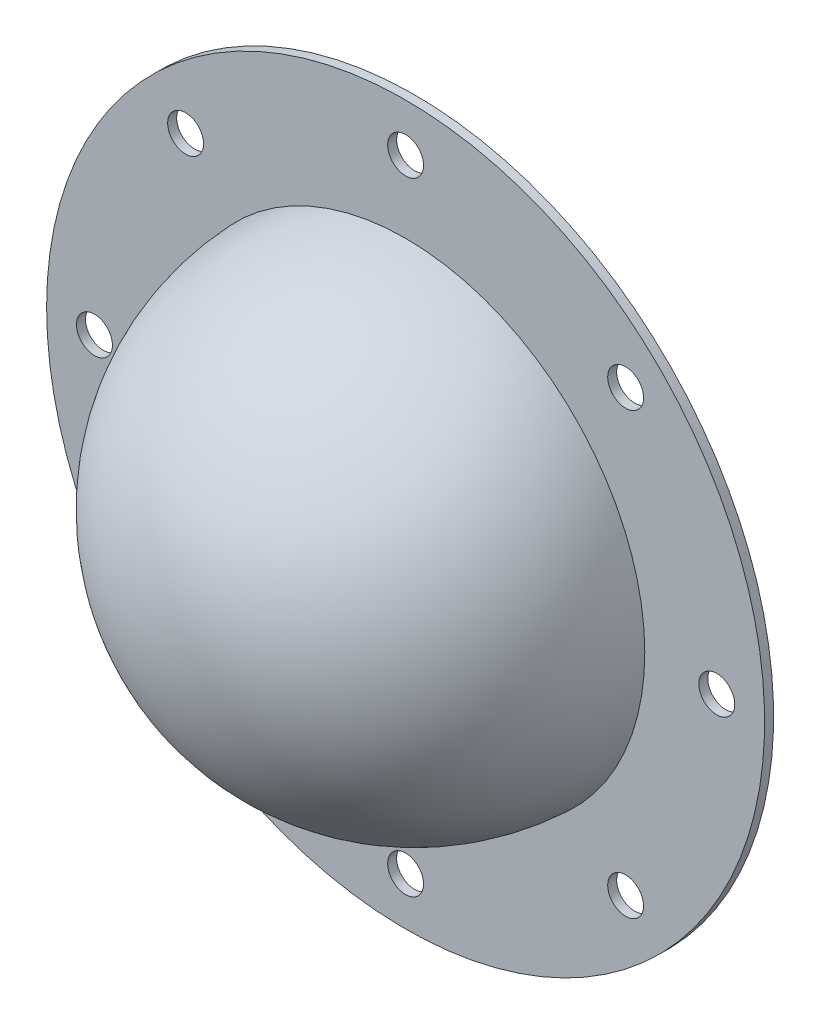
ISO-10303-21;
HEADER;
FILE_DESCRIPTION(('STEP AP214'),'2;1');
FILE_NAME('part.step','',(''),(''),'','','');
FILE_SCHEMA(('AUTOMOTIVE_DESIGN { 1 0 10303 214 1 1 1 1 }'));
ENDSEC;
DATA;
#1=APPLICATION_CONTEXT('core data for automotive mechanical design processes');
#2=APPLICATION_PROTOCOL_DEFINITION('international standard','automotive_design',2000,#1);
#3=PRODUCT_CONTEXT('',#1,'mechanical');
#4=PRODUCT('Part','Part','',(#3));
#5=PRODUCT_RELATED_PRODUCT_CATEGORY('part','',(#4));
#6=PRODUCT_DEFINITION_FORMATION('','',#4);
#7=PRODUCT_DEFINITION_CONTEXT('part definition',#1,'design');
#8=PRODUCT_DEFINITION('design','',#6,#7);
#9=PRODUCT_DEFINITION_SHAPE('','',#8);
#10=(LENGTH_UNIT() NAMED_UNIT(*) SI_UNIT(.MILLI.,.METRE.));
#11=(NAMED_UNIT(*) PLANE_ANGLE_UNIT() SI_UNIT($,.RADIAN.));
#12=(NAMED_UNIT(*) SI_UNIT($,.STERADIAN.) SOLID_ANGLE_UNIT());
#13=UNCERTAINTY_MEASURE_WITH_UNIT(LENGTH_MEASURE(1.E-05),#10,'distance_accuracy_value','');
#14=(GEOMETRIC_REPRESENTATION_CONTEXT(3) GLOBAL_UNCERTAINTY_ASSIGNED_CONTEXT((#13)) GLOBAL_UNIT_ASSIGNED_CONTEXT((#10,
#11,#12)) REPRESENTATION_CONTEXT('',''));
#15=CARTESIAN_POINT('',(0.,0.,0.));
#16=DIRECTION('',(0.,0.,1.));
#17=DIRECTION('',(1.,0.,0.));
#18=AXIS2_PLACEMENT_3D('',#15,#16,#17);
#19=CARTESIAN_POINT('',(-18.7622063786877,13.2376651058153,0.));
#20=DIRECTION('',(0.,0.,1.));
#21=DIRECTION('',(1.,0.,0.));
#22=AXIS2_PLACEMENT_3D('',#19,#20,#21);
#23=PLANE('',#22);
#24=CARTESIAN_POINT('',(-1.81557029619843E-13,52.,0.));
#25=DIRECTION('',(0.,0.,1.));
#26=DIRECTION('',(1.,0.,0.));
#27=AXIS2_PLACEMENT_3D('',#24,#25,#26);
#28=CIRCLE('',#27,3.);
#29=CARTESIAN_POINT('',(2.99999999999982,52.,0.));
#30=VERTEX_POINT('',#29);
#31=EDGE_CURVE('E71',#30,#30,#28,.T.);
#32=ORIENTED_EDGE('',*,*,#31,.T.);
#33=EDGE_LOOP('',(#32));
#34=FACE_BOUND('',#33,.T.);
#35=CARTESIAN_POINT('',(-36.7695526217007,36.7695526217003,0.));
#36=DIRECTION('',(0.,0.,1.));
#37=DIRECTION('',(1.,0.,0.));
#38=AXIS2_PLACEMENT_3D('',#35,#36,#37);
#39=CIRCLE('',#38,3.);
#40=CARTESIAN_POINT('',(-33.7695526217007,36.7695526217003,0.));
#41=VERTEX_POINT('',#40);
#42=EDGE_CURVE('E74',#41,#41,#39,.T.);
#43=ORIENTED_EDGE('',*,*,#42,.T.);
#44=EDGE_LOOP('',(#43));
#45=FACE_BOUND('',#44,.T.);
#46=CARTESIAN_POINT('',(-52.,0.,0.));
#47=DIRECTION('',(0.,0.,1.));
#48=DIRECTION('',(1.,0.,0.));
#49=AXIS2_PLACEMENT_3D('',#46,#47,#48);
#50=CIRCLE('',#49,3.);
#51=CARTESIAN_POINT('',(-49.,0.,0.));
#52=VERTEX_POINT('',#51);
#53=EDGE_CURVE('E77',#52,#52,#50,.T.);
#54=ORIENTED_EDGE('',*,*,#53,.T.);
#55=EDGE_LOOP('',(#54));
#56=FACE_BOUND('',#55,.T.);
#57=CARTESIAN_POINT('',(-36.7695526217002,-36.7695526217008,0.));
#58=DIRECTION('',(0.,0.,1.));
#59=DIRECTION('',(1.,0.,0.));
#60=AXIS2_PLACEMENT_3D('',#57,#58,#59);
#61=CIRCLE('',#60,3.);
#62=CARTESIAN_POINT('',(-33.7695526217001,-36.7695526217008,0.));
#63=VERTEX_POINT('',#62);
#64=EDGE_CURVE('E80',#63,#63,#61,.T.);
#65=ORIENTED_EDGE('',*,*,#64,.T.);
#66=EDGE_LOOP('',(#65));
#67=FACE_BOUND('',#66,.T.);
#68=CARTESIAN_POINT('',(5.44671088859529E-13,-52.,0.));
#69=DIRECTION('',(0.,0.,1.));
#70=DIRECTION('',(1.,0.,0.));
#71=AXIS2_PLACEMENT_3D('',#68,#69,#70);
#72=CIRCLE('',#71,3.);
#73=CARTESIAN_POINT('',(3.00000000000055,-52.,0.));
#74=VERTEX_POINT('',#73);
#75=EDGE_CURVE('E83',#74,#74,#72,.T.);
#76=ORIENTED_EDGE('',*,*,#75,.T.);
#77=EDGE_LOOP('',(#76));
#78=FACE_BOUND('',#77,.T.);
#79=CARTESIAN_POINT('',(36.7695526217009,-36.7695526217,0.));
#80=DIRECTION('',(0.,0.,1.));
#81=DIRECTION('',(1.,0.,0.));
#82=AXIS2_PLACEMENT_3D('',#79,#80,#81);
#83=CIRCLE('',#82,3.);
#84=CARTESIAN_POINT('',(39.7695526217009,-36.7695526217,0.));
#85=VERTEX_POINT('',#84);
#86=EDGE_CURVE('E86',#85,#85,#83,.T.);
#87=ORIENTED_EDGE('',*,*,#86,.T.);
#88=EDGE_LOOP('',(#87));
#89=FACE_BOUND('',#88,.T.);
#90=CARTESIAN_POINT('',(36.7695526217004,36.7695526217005,0.));
#91=DIRECTION('',(0.,0.,1.));
#92=DIRECTION('',(1.,0.,0.));
#93=AXIS2_PLACEMENT_3D('',#90,#91,#92);
#94=CIRCLE('',#93,3.);
#95=CARTESIAN_POINT('',(39.7695526217004,36.7695526217005,0.));
#96=VERTEX_POINT('',#95);
#97=EDGE_CURVE('E89',#96,#96,#94,.T.);
#98=ORIENTED_EDGE('',*,*,#97,.T.);
#99=EDGE_LOOP('',(#98));
#100=FACE_BOUND('',#99,.T.);
#101=CARTESIAN_POINT('',(52.,0.,0.));
#102=DIRECTION('',(0.,0.,1.));
#103=DIRECTION('',(1.,0.,0.));
#104=AXIS2_PLACEMENT_3D('',#101,#102,#103);
#105=CIRCLE('',#104,3.);
#106=CARTESIAN_POINT('',(55.,0.,0.));
#107=VERTEX_POINT('',#106);
#108=EDGE_CURVE('E65',#107,#107,#105,.T.);
#109=ORIENTED_EDGE('',*,*,#108,.T.);
#110=EDGE_LOOP('',(#109));
#111=FACE_BOUND('',#110,.T.);
#112=CARTESIAN_POINT('',(0.,0.,0.));
#113=DIRECTION('',(0.,0.,-1.));
#114=DIRECTION('',(-1.,0.,0.));
#115=AXIS2_PLACEMENT_3D('',#112,#113,#114);
#116=CIRCLE('',#115,60.);
#117=CARTESIAN_POINT('',(-60.,0.,0.));
#118=VERTEX_POINT('',#117);
#119=EDGE_CURVE('E48',#118,#118,#116,.T.);
#120=ORIENTED_EDGE('',*,*,#119,.T.);
#121=EDGE_LOOP('',(#120));
#122=FACE_BOUND('',#121,.T.);
#123=CARTESIAN_POINT('',(0.,0.,0.));
#124=DIRECTION('',(0.,0.,-1.));
#125=DIRECTION('',(-1.,0.,0.));
#126=AXIS2_PLACEMENT_3D('',#123,#124,#125);
#127=CIRCLE('',#126,45.);
#128=CARTESIAN_POINT('',(-45.,0.,0.));
#129=VERTEX_POINT('',#128);
#130=EDGE_CURVE('E52',#129,#129,#127,.T.);
#131=ORIENTED_EDGE('',*,*,#130,.F.);
#132=EDGE_LOOP('',(#131));
#133=FACE_BOUND('',#132,.T.);
#134=ADVANCED_FACE('F33',(#34,#45,#56,#67,#78,#89,#100,#111,#122,#133),#23,.F.);
#135=CARTESIAN_POINT('',(0.,0.,1.5));
#136=DIRECTION('',(0.,0.,-1.));
#137=DIRECTION('',(-1.,0.,0.));
#138=AXIS2_PLACEMENT_3D('',#135,#136,#137);
#139=CYLINDRICAL_SURFACE('',#138,60.);
#140=CARTESIAN_POINT('',(0.,0.,1.5));
#141=DIRECTION('',(0.,0.,-1.));
#142=DIRECTION('',(-1.,0.,0.));
#143=AXIS2_PLACEMENT_3D('',#140,#141,#142);
#144=CIRCLE('',#143,60.);
#145=CARTESIAN_POINT('',(-60.,0.,1.5));
#146=VERTEX_POINT('',#145);
#147=EDGE_CURVE('E44',#146,#146,#144,.T.);
#148=ORIENTED_EDGE('',*,*,#147,.T.);
#149=EDGE_LOOP('',(#148));
#150=FACE_BOUND('',#149,.T.);
#151=ORIENTED_EDGE('',*,*,#119,.F.);
#152=EDGE_LOOP('',(#151));
#153=FACE_BOUND('',#152,.T.);
#154=ADVANCED_FACE('F120',(#150,#153),#139,.T.);
#155=CARTESIAN_POINT('',(0.,0.,1.5));
#156=DIRECTION('',(0.,0.,-1.));
#157=DIRECTION('',(-1.,0.,0.));
#158=AXIS2_PLACEMENT_3D('',#155,#156,#157);
#159=PLANE('',#158);
#160=CARTESIAN_POINT('',(-1.81557029619843E-13,52.,1.5));
#161=DIRECTION('',(0.,0.,1.));
#162=DIRECTION('',(0.,1.,0.));
#163=AXIS2_PLACEMENT_3D('',#160,#161,#162);
#164=CIRCLE('',#163,3.);
#165=CARTESIAN_POINT('',(-1.92031473636372E-13,55.,1.5));
#166=VERTEX_POINT('',#165);
#167=EDGE_CURVE('E95',#166,#166,#164,.T.);
#168=ORIENTED_EDGE('',*,*,#167,.F.);
#169=EDGE_LOOP('',(#168));
#170=FACE_BOUND('',#169,.T.);
#171=CARTESIAN_POINT('',(-36.7695526217007,36.7695526217003,1.5));
#172=DIRECTION('',(0.,0.,1.));
#173=DIRECTION('',(-0.707106781186551,0.707106781186544,0.));
#174=AXIS2_PLACEMENT_3D('',#171,#172,#173);
#175=CIRCLE('',#174,3.);
#176=CARTESIAN_POINT('',(-38.8908729652603,38.8908729652599,1.5));
#177=VERTEX_POINT('',#176);
#178=EDGE_CURVE('E103',#177,#177,#175,.T.);
#179=ORIENTED_EDGE('',*,*,#178,.F.);
#180=EDGE_LOOP('',(#179));
#181=FACE_BOUND('',#180,.T.);
#182=CARTESIAN_POINT('',(-52.,0.,1.5));
#183=DIRECTION('',(0.,0.,1.));
#184=DIRECTION('',(-1.,0.,0.));
#185=AXIS2_PLACEMENT_3D('',#182,#183,#184);
#186=CIRCLE('',#185,3.);
#187=CARTESIAN_POINT('',(-55.,0.,1.5));
#188=VERTEX_POINT('',#187);
#189=EDGE_CURVE('E99',#188,#188,#186,.T.);
#190=ORIENTED_EDGE('',*,*,#189,.F.);
#191=EDGE_LOOP('',(#190));
#192=FACE_BOUND('',#191,.T.);
#193=CARTESIAN_POINT('',(-36.7695526217002,-36.7695526217008,1.5));
#194=DIRECTION('',(0.,0.,1.));
#195=DIRECTION('',(-0.707106781186541,-0.707106781186554,0.));
#196=AXIS2_PLACEMENT_3D('',#193,#194,#195);
#197=CIRCLE('',#196,3.);
#198=CARTESIAN_POINT('',(-38.8908729652598,-38.8908729652604,1.5));
#199=VERTEX_POINT('',#198);
#200=EDGE_CURVE('E96',#199,#199,#197,.T.);
#201=ORIENTED_EDGE('',*,*,#200,.F.);
#202=EDGE_LOOP('',(#201));
#203=FACE_BOUND('',#202,.T.);
#204=CARTESIAN_POINT('',(5.44671088859529E-13,-52.,1.5));
#205=DIRECTION('',(0.,0.,1.));
#206=DIRECTION('',(0.,-1.,0.));
#207=AXIS2_PLACEMENT_3D('',#204,#205,#206);
#208=CIRCLE('',#207,3.);
#209=CARTESIAN_POINT('',(5.76094420909117E-13,-55.,1.5));
#210=VERTEX_POINT('',#209);
#211=EDGE_CURVE('E100',#210,#210,#208,.T.);
#212=ORIENTED_EDGE('',*,*,#211,.F.);
#213=EDGE_LOOP('',(#212));
#214=FACE_BOUND('',#213,.T.);
#215=CARTESIAN_POINT('',(36.7695526217009,-36.7695526217,1.5));
#216=DIRECTION('',(0.,0.,1.));
#217=DIRECTION('',(0.707106781186556,-0.707106781186539,0.));
#218=AXIS2_PLACEMENT_3D('',#215,#216,#217);
#219=CIRCLE('',#218,3.);
#220=CARTESIAN_POINT('',(38.8908729652606,-38.8908729652596,1.5));
#221=VERTEX_POINT('',#220);
#222=EDGE_CURVE('E108',#221,#221,#219,.T.);
#223=ORIENTED_EDGE('',*,*,#222,.F.);
#224=EDGE_LOOP('',(#223));
#225=FACE_BOUND('',#224,.T.);
#226=CARTESIAN_POINT('',(36.7695526217004,36.7695526217005,1.5));
#227=DIRECTION('',(0.,0.,1.));
#228=DIRECTION('',(0.707106781186546,0.707106781186549,0.));
#229=AXIS2_PLACEMENT_3D('',#226,#227,#228);
#230=CIRCLE('',#229,3.);
#231=CARTESIAN_POINT('',(38.89087296526,38.8908729652602,1.5));
#232=VERTEX_POINT('',#231);
#233=EDGE_CURVE('E92',#232,#232,#230,.T.);
#234=ORIENTED_EDGE('',*,*,#233,.F.);
#235=EDGE_LOOP('',(#234));
#236=FACE_BOUND('',#235,.T.);
#237=CARTESIAN_POINT('',(52.,0.,1.5));
#238=DIRECTION('',(0.,0.,1.));
#239=DIRECTION('',(1.,0.,0.));
#240=AXIS2_PLACEMENT_3D('',#237,#238,#239);
#241=CIRCLE('',#240,3.);
#242=CARTESIAN_POINT('',(55.,0.,1.5));
#243=VERTEX_POINT('',#242);
#244=EDGE_CURVE('E68',#243,#243,#241,.T.);
#245=ORIENTED_EDGE('',*,*,#244,.F.);
#246=EDGE_LOOP('',(#245));
#247=FACE_BOUND('',#246,.T.);
#248=CARTESIAN_POINT('',(0.,0.,1.5));
#249=DIRECTION('',(0.,0.,-1.));
#250=DIRECTION('',(-1.,0.,0.));
#251=AXIS2_PLACEMENT_3D('',#248,#249,#250);
#252=CIRCLE('',#251,39.9718651053463);
#253=CARTESIAN_POINT('',(-39.9718651053463,0.,1.5));
#254=VERTEX_POINT('',#253);
#255=EDGE_CURVE('E10',#254,#254,#252,.T.);
#256=ORIENTED_EDGE('',*,*,#255,.T.);
#257=EDGE_LOOP('',(#256));
#258=FACE_BOUND('',#257,.T.);
#259=ORIENTED_EDGE('',*,*,#147,.F.);
#260=EDGE_LOOP('',(#259));
#261=FACE_BOUND('',#260,.T.);
#262=ADVANCED_FACE('F117',(#170,#181,#192,#203,#214,#225,#236,#247,#258,#261),#159,.F.);
#263=CARTESIAN_POINT('',(0.,0.,0.));
#264=DIRECTION('',(0.,0.,1.));
#265=DIRECTION('',(0.,1.,0.));
#266=AXIS2_PLACEMENT_3D('',#263,#264,#265);
#267=SPHERICAL_SURFACE('',#266,40.);
#268=ORIENTED_EDGE('',*,*,#255,.F.);
#269=EDGE_LOOP('',(#268));
#270=FACE_BOUND('',#269,.T.);
#271=ADVANCED_FACE('F35',(#270),#267,.T.);
#272=CARTESIAN_POINT('',(0.,0.,-24.6606940692324));
#273=DIRECTION('',(0.,0.,-1.));
#274=DIRECTION('',(-1.,0.,0.));
#275=AXIS2_PLACEMENT_3D('',#272,#273,#274);
#276=CYLINDRICAL_SURFACE('',#275,45.);
#277=ORIENTED_EDGE('',*,*,#130,.T.);
#278=EDGE_LOOP('',(#277));
#279=FACE_BOUND('',#278,.T.);
#280=CARTESIAN_POINT('',(0.,0.,-2.));
#281=DIRECTION('',(0.,0.,-1.));
#282=DIRECTION('',(-1.,0.,0.));
#283=AXIS2_PLACEMENT_3D('',#280,#281,#282);
#284=CIRCLE('',#283,45.);
#285=CARTESIAN_POINT('',(-45.,0.,-2.));
#286=VERTEX_POINT('',#285);
#287=EDGE_CURVE('E56',#286,#286,#284,.T.);
#288=ORIENTED_EDGE('',*,*,#287,.F.);
#289=EDGE_LOOP('',(#288));
#290=FACE_BOUND('',#289,.T.);
#291=ADVANCED_FACE('F142',(#279,#290),#276,.T.);
#292=CARTESIAN_POINT('',(-45.,0.,-2.));
#293=DIRECTION('',(0.,0.,-1.));
#294=DIRECTION('',(-1.,0.,0.));
#295=AXIS2_PLACEMENT_3D('',#292,#293,#294);
#296=PLANE('',#295);
#297=ORIENTED_EDGE('',*,*,#287,.T.);
#298=EDGE_LOOP('',(#297));
#299=FACE_BOUND('',#298,.T.);
#300=CARTESIAN_POINT('',(0.,0.,-2.));
#301=DIRECTION('',(0.,0.,-1.));
#302=DIRECTION('',(-1.,0.,0.));
#303=AXIS2_PLACEMENT_3D('',#300,#301,#302);
#304=CIRCLE('',#303,43.);
#305=CARTESIAN_POINT('',(-43.,0.,-2.));
#306=VERTEX_POINT('',#305);
#307=EDGE_CURVE('E59',#306,#306,#304,.T.);
#308=ORIENTED_EDGE('',*,*,#307,.F.);
#309=EDGE_LOOP('',(#308));
#310=FACE_BOUND('',#309,.T.);
#311=ADVANCED_FACE('F145',(#299,#310),#296,.T.);
#312=CARTESIAN_POINT('',(0.,0.,-24.6606940692324));
#313=DIRECTION('',(0.,0.,-1.));
#314=DIRECTION('',(-1.,0.,0.));
#315=AXIS2_PLACEMENT_3D('',#312,#313,#314);
#316=CYLINDRICAL_SURFACE('',#315,43.);
#317=ORIENTED_EDGE('',*,*,#307,.T.);
#318=EDGE_LOOP('',(#317));
#319=FACE_BOUND('',#318,.T.);
#320=CARTESIAN_POINT('',(0.,0.,0.));
#321=DIRECTION('',(0.,0.,-1.));
#322=DIRECTION('',(-1.,0.,0.));
#323=AXIS2_PLACEMENT_3D('',#320,#321,#322);
#324=CIRCLE('',#323,43.);
#325=CARTESIAN_POINT('',(-43.,0.,0.));
#326=VERTEX_POINT('',#325);
#327=EDGE_CURVE('E62',#326,#326,#324,.T.);
#328=ORIENTED_EDGE('',*,*,#327,.F.);
#329=EDGE_LOOP('',(#328));
#330=FACE_BOUND('',#329,.T.);
#331=ADVANCED_FACE('F151',(#319,#330),#316,.F.);
#332=CARTESIAN_POINT('',(0.,0.,0.));
#333=DIRECTION('',(0.,0.,-1.));
#334=DIRECTION('',(1.,0.,0.));
#335=AXIS2_PLACEMENT_3D('',#332,#333,#334);
#336=SPHERICAL_SURFACE('',#335,38.5);
#337=CARTESIAN_POINT('',(0.,0.,0.));
#338=DIRECTION('',(0.,0.,1.));
#339=DIRECTION('',(1.,0.,0.));
#340=AXIS2_PLACEMENT_3D('',#337,#338,#339);
#341=CIRCLE('',#340,38.5);
#342=CARTESIAN_POINT('',(38.5,0.,0.));
#343=VERTEX_POINT('',#342);
#344=EDGE_CURVE('E40',#343,#343,#341,.F.);
#345=ORIENTED_EDGE('',*,*,#344,.T.);
#346=EDGE_LOOP('',(#345));
#347=FACE_BOUND('',#346,.T.);
#348=ADVANCED_FACE('F157',(#347),#336,.F.);
#349=ORIENTED_EDGE('',*,*,#344,.F.);
#350=EDGE_LOOP('',(#349));
#351=FACE_BOUND('',#350,.T.);
#352=ORIENTED_EDGE('',*,*,#327,.T.);
#353=EDGE_LOOP('',(#352));
#354=FACE_BOUND('',#353,.T.);
#355=ADVANCED_FACE('F139',(#351,#354),#23,.F.);
#356=CARTESIAN_POINT('',(52.,0.,-18.5));
#357=DIRECTION('',(0.,0.,1.));
#358=DIRECTION('',(1.,0.,0.));
#359=AXIS2_PLACEMENT_3D('',#356,#357,#358);
#360=CYLINDRICAL_SURFACE('',#359,3.);
#361=ORIENTED_EDGE('',*,*,#244,.T.);
#362=EDGE_LOOP('',(#361));
#363=FACE_BOUND('',#362,.T.);
#364=ORIENTED_EDGE('',*,*,#108,.F.);
#365=EDGE_LOOP('',(#364));
#366=FACE_BOUND('',#365,.T.);
#367=ADVANCED_FACE('F162',(#363,#366),#360,.F.);
#368=CARTESIAN_POINT('',(36.7695526217004,36.7695526217005,-18.5));
#369=DIRECTION('',(0.,0.,1.));
#370=DIRECTION('',(1.,0.,0.));
#371=AXIS2_PLACEMENT_3D('',#368,#369,#370);
#372=CYLINDRICAL_SURFACE('',#371,3.);
#373=ORIENTED_EDGE('',*,*,#233,.T.);
#374=EDGE_LOOP('',(#373));
#375=FACE_BOUND('',#374,.T.);
#376=ORIENTED_EDGE('',*,*,#97,.F.);
#377=EDGE_LOOP('',(#376));
#378=FACE_BOUND('',#377,.T.);
#379=ADVANCED_FACE('F168',(#375,#378),#372,.F.);
#380=CARTESIAN_POINT('',(36.7695526217009,-36.7695526217,-18.5));
#381=DIRECTION('',(0.,0.,1.));
#382=DIRECTION('',(1.,0.,0.));
#383=AXIS2_PLACEMENT_3D('',#380,#381,#382);
#384=CYLINDRICAL_SURFACE('',#383,3.);
#385=ORIENTED_EDGE('',*,*,#222,.T.);
#386=EDGE_LOOP('',(#385));
#387=FACE_BOUND('',#386,.T.);
#388=ORIENTED_EDGE('',*,*,#86,.F.);
#389=EDGE_LOOP('',(#388));
#390=FACE_BOUND('',#389,.T.);
#391=ADVANCED_FACE('F175',(#387,#390),#384,.F.);
#392=CARTESIAN_POINT('',(5.44671088859529E-13,-52.,-18.5));
#393=DIRECTION('',(0.,0.,1.));
#394=DIRECTION('',(1.,0.,0.));
#395=AXIS2_PLACEMENT_3D('',#392,#393,#394);
#396=CYLINDRICAL_SURFACE('',#395,3.);
#397=ORIENTED_EDGE('',*,*,#211,.T.);
#398=EDGE_LOOP('',(#397));
#399=FACE_BOUND('',#398,.T.);
#400=ORIENTED_EDGE('',*,*,#75,.F.);
#401=EDGE_LOOP('',(#400));
#402=FACE_BOUND('',#401,.T.);
#403=ADVANCED_FACE('F114',(#399,#402),#396,.F.);
#404=CARTESIAN_POINT('',(-36.7695526217002,-36.7695526217008,-18.5));
#405=DIRECTION('',(0.,0.,1.));
#406=DIRECTION('',(1.,0.,0.));
#407=AXIS2_PLACEMENT_3D('',#404,#405,#406);
#408=CYLINDRICAL_SURFACE('',#407,3.);
#409=ORIENTED_EDGE('',*,*,#200,.T.);
#410=EDGE_LOOP('',(#409));
#411=FACE_BOUND('',#410,.T.);
#412=ORIENTED_EDGE('',*,*,#64,.F.);
#413=EDGE_LOOP('',(#412));
#414=FACE_BOUND('',#413,.T.);
#415=ADVANCED_FACE('F177',(#411,#414),#408,.F.);
#416=CARTESIAN_POINT('',(-52.,0.,-18.5));
#417=DIRECTION('',(0.,0.,1.));
#418=DIRECTION('',(1.,0.,0.));
#419=AXIS2_PLACEMENT_3D('',#416,#417,#418);
#420=CYLINDRICAL_SURFACE('',#419,3.);
#421=ORIENTED_EDGE('',*,*,#189,.T.);
#422=EDGE_LOOP('',(#421));
#423=FACE_BOUND('',#422,.T.);
#424=ORIENTED_EDGE('',*,*,#53,.F.);
#425=EDGE_LOOP('',(#424));
#426=FACE_BOUND('',#425,.T.);
#427=ADVANCED_FACE('F180',(#423,#426),#420,.F.);
#428=CARTESIAN_POINT('',(-36.7695526217007,36.7695526217003,-18.5));
#429=DIRECTION('',(0.,0.,1.));
#430=DIRECTION('',(1.,0.,0.));
#431=AXIS2_PLACEMENT_3D('',#428,#429,#430);
#432=CYLINDRICAL_SURFACE('',#431,3.);
#433=ORIENTED_EDGE('',*,*,#178,.T.);
#434=EDGE_LOOP('',(#433));
#435=FACE_BOUND('',#434,.T.);
#436=ORIENTED_EDGE('',*,*,#42,.F.);
#437=EDGE_LOOP('',(#436));
#438=FACE_BOUND('',#437,.T.);
#439=ADVANCED_FACE('F184',(#435,#438),#432,.F.);
#440=CARTESIAN_POINT('',(-1.81557029619843E-13,52.,-18.5));
#441=DIRECTION('',(0.,0.,1.));
#442=DIRECTION('',(1.,0.,0.));
#443=AXIS2_PLACEMENT_3D('',#440,#441,#442);
#444=CYLINDRICAL_SURFACE('',#443,3.);
#445=ORIENTED_EDGE('',*,*,#167,.T.);
#446=EDGE_LOOP('',(#445));
#447=FACE_BOUND('',#446,.T.);
#448=ORIENTED_EDGE('',*,*,#31,.F.);
#449=EDGE_LOOP('',(#448));
#450=FACE_BOUND('',#449,.T.);
#451=ADVANCED_FACE('F188',(#447,#450),#444,.F.);
#452=CLOSED_SHELL('',(#134,#154,#262,#271,#291,#311,#331,#348,#355,#367,#379,#391,#403,#415,
#427,#439,#451));
#453=MANIFOLD_SOLID_BREP('B2',#452);
#454=ADVANCED_BREP_SHAPE_REPRESENTATION('',(#18,#453),#14);
#455=SHAPE_DEFINITION_REPRESENTATION(#9,#454);
ENDSEC;
END-ISO-10303-21;
